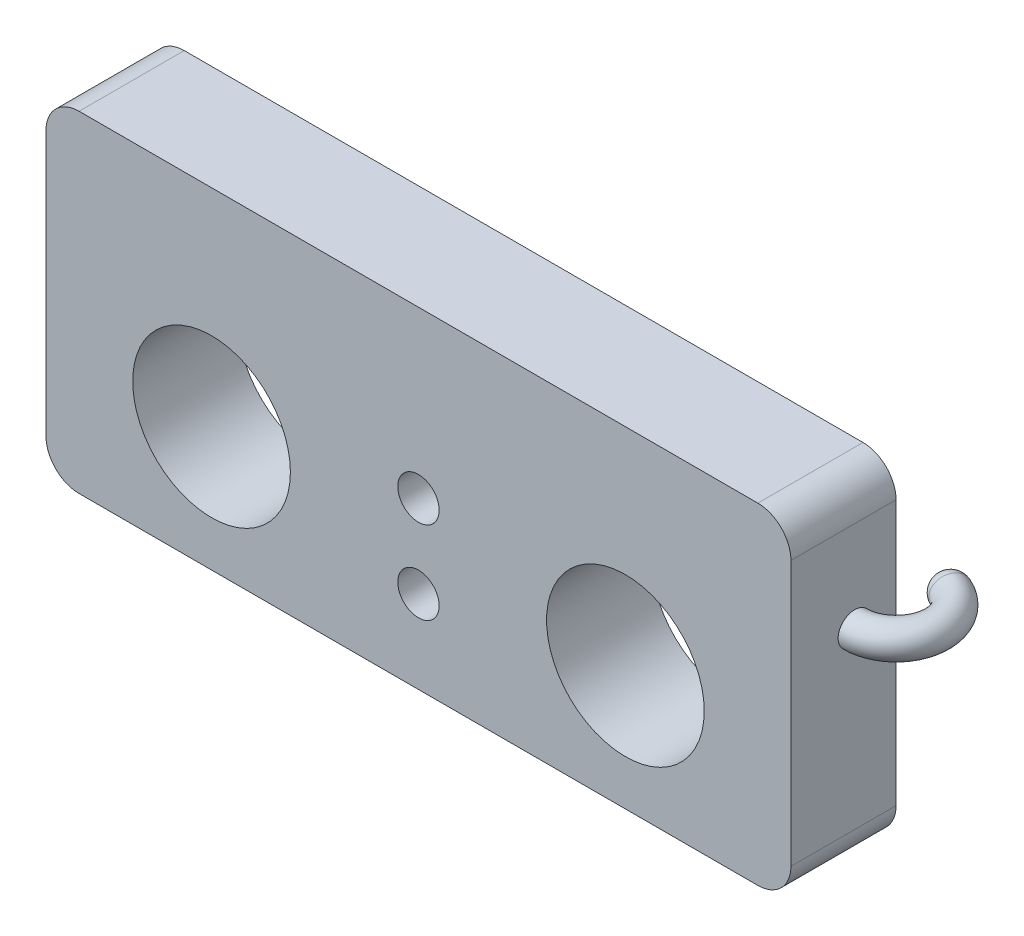
ISO-10303-21;
HEADER;
FILE_DESCRIPTION(('STEP AP214'),'2;1');
FILE_NAME('part.step','',(''),(''),'','','');
FILE_SCHEMA(('AUTOMOTIVE_DESIGN { 1 0 10303 214 1 1 1 1 }'));
ENDSEC;
DATA;
#1=APPLICATION_CONTEXT('core data for automotive mechanical design processes');
#2=APPLICATION_PROTOCOL_DEFINITION('international standard','automotive_design',2000,#1);
#3=PRODUCT_CONTEXT('',#1,'mechanical');
#4=PRODUCT('Part','Part','',(#3));
#5=PRODUCT_RELATED_PRODUCT_CATEGORY('part','',(#4));
#6=PRODUCT_DEFINITION_FORMATION('','',#4);
#7=PRODUCT_DEFINITION_CONTEXT('part definition',#1,'design');
#8=PRODUCT_DEFINITION('design','',#6,#7);
#9=PRODUCT_DEFINITION_SHAPE('','',#8);
#10=(LENGTH_UNIT() NAMED_UNIT(*) SI_UNIT(.MILLI.,.METRE.));
#11=(NAMED_UNIT(*) PLANE_ANGLE_UNIT() SI_UNIT($,.RADIAN.));
#12=(NAMED_UNIT(*) SI_UNIT($,.STERADIAN.) SOLID_ANGLE_UNIT());
#13=UNCERTAINTY_MEASURE_WITH_UNIT(LENGTH_MEASURE(1.E-05),#10,'distance_accuracy_value','');
#14=(GEOMETRIC_REPRESENTATION_CONTEXT(3) GLOBAL_UNCERTAINTY_ASSIGNED_CONTEXT((#13)) GLOBAL_UNIT_ASSIGNED_CONTEXT((#10,
#11,#12)) REPRESENTATION_CONTEXT('',''));
#15=CARTESIAN_POINT('',(0.,0.,0.));
#16=DIRECTION('',(0.,0.,1.));
#17=DIRECTION('',(1.,0.,0.));
#18=AXIS2_PLACEMENT_3D('',#15,#16,#17);
#19=CARTESIAN_POINT('',(0.,0.,6.35));
#20=DIRECTION('',(0.,0.,1.));
#21=DIRECTION('',(1.,0.,0.));
#22=AXIS2_PLACEMENT_3D('',#19,#20,#21);
#23=PLANE('',#22);
#24=CARTESIAN_POINT('',(5.81896551724137,-6.28448275862069,6.35));
#25=DIRECTION('',(0.,0.,1.));
#26=DIRECTION('',(1.,0.,0.));
#27=AXIS2_PLACEMENT_3D('',#24,#25,#26);
#28=CIRCLE('',#27,1.25);
#29=CARTESIAN_POINT('',(7.06896551724137,-6.28448275862069,6.35));
#30=VERTEX_POINT('',#29);
#31=EDGE_CURVE('E142',#30,#30,#28,.T.);
#32=ORIENTED_EDGE('',*,*,#31,.F.);
#33=EDGE_LOOP('',(#32));
#34=FACE_BOUND('',#33,.T.);
#35=CARTESIAN_POINT('',(5.81896551724137,-11.2844827586207,6.35));
#36=DIRECTION('',(0.,0.,1.));
#37=DIRECTION('',(1.,0.,0.));
#38=AXIS2_PLACEMENT_3D('',#35,#36,#37);
#39=CIRCLE('',#38,1.25);
#40=CARTESIAN_POINT('',(7.06896551724137,-11.2844827586207,6.35));
#41=VERTEX_POINT('',#40);
#42=EDGE_CURVE('E138',#41,#41,#39,.T.);
#43=ORIENTED_EDGE('',*,*,#42,.F.);
#44=EDGE_LOOP('',(#43));
#45=FACE_BOUND('',#44,.T.);
#46=CARTESIAN_POINT('',(-6.68103448275862,-8.78448275862069,6.35));
#47=DIRECTION('',(0.,0.,1.));
#48=DIRECTION('',(1.,0.,0.));
#49=AXIS2_PLACEMENT_3D('',#46,#47,#48);
#50=CIRCLE('',#49,4.7625);
#51=CARTESIAN_POINT('',(-1.91853448275862,-8.78448275862069,6.35));
#52=VERTEX_POINT('',#51);
#53=EDGE_CURVE('E271',#52,#52,#50,.T.);
#54=ORIENTED_EDGE('',*,*,#53,.F.);
#55=EDGE_LOOP('',(#54));
#56=FACE_BOUND('',#55,.T.);
#57=DIRECTION('',(1.,0.,0.));
#58=VECTOR('',#57,1.);
#59=CARTESIAN_POINT('',(-16.6810344827586,-16.2844827586207,6.35));
#60=LINE('',#59,#58);
#61=CARTESIAN_POINT('',(-14.6810344827586,-16.2844827586207,6.35));
#62=VERTEX_POINT('',#61);
#63=CARTESIAN_POINT('',(26.3189655172414,-16.2844827586207,6.35));
#64=VERTEX_POINT('',#63);
#65=EDGE_CURVE('E262',#62,#64,#60,.T.);
#66=ORIENTED_EDGE('',*,*,#65,.T.);
#67=CARTESIAN_POINT('',(26.3189655172414,-14.2844827586207,6.35));
#68=DIRECTION('',(0.,0.,1.));
#69=DIRECTION('',(1.,0.,0.));
#70=AXIS2_PLACEMENT_3D('',#67,#68,#69);
#71=CIRCLE('',#70,2.);
#72=CARTESIAN_POINT('',(28.3189655172414,-14.2844827586207,6.35));
#73=VERTEX_POINT('',#72);
#74=EDGE_CURVE('E157',#64,#73,#71,.T.);
#75=ORIENTED_EDGE('',*,*,#74,.T.);
#76=DIRECTION('',(0.,1.,0.));
#77=VECTOR('',#76,1.);
#78=CARTESIAN_POINT('',(28.3189655172414,3.71551724137931,6.35));
#79=LINE('',#78,#77);
#80=CARTESIAN_POINT('',(28.3189655172414,1.71551724137931,6.35));
#81=VERTEX_POINT('',#80);
#82=EDGE_CURVE('E118',#73,#81,#79,.T.);
#83=ORIENTED_EDGE('',*,*,#82,.T.);
#84=CARTESIAN_POINT('',(26.3189655172414,1.71551724137931,6.35));
#85=DIRECTION('',(0.,0.,1.));
#86=DIRECTION('',(1.,0.,0.));
#87=AXIS2_PLACEMENT_3D('',#84,#85,#86);
#88=CIRCLE('',#87,2.);
#89=CARTESIAN_POINT('',(26.3189655172414,3.71551724137931,6.35));
#90=VERTEX_POINT('',#89);
#91=EDGE_CURVE('E54',#81,#90,#88,.T.);
#92=ORIENTED_EDGE('',*,*,#91,.T.);
#93=DIRECTION('',(-1.,0.,0.));
#94=VECTOR('',#93,1.);
#95=CARTESIAN_POINT('',(-16.6810344827586,3.71551724137931,6.35));
#96=LINE('',#95,#94);
#97=CARTESIAN_POINT('',(-14.6810344827586,3.71551724137931,6.35));
#98=VERTEX_POINT('',#97);
#99=EDGE_CURVE('E143',#90,#98,#96,.T.);
#100=ORIENTED_EDGE('',*,*,#99,.T.);
#101=CARTESIAN_POINT('',(-14.6810344827586,1.71551724137931,6.35));
#102=DIRECTION('',(0.,0.,1.));
#103=DIRECTION('',(1.,0.,0.));
#104=AXIS2_PLACEMENT_3D('',#101,#102,#103);
#105=CIRCLE('',#104,2.);
#106=CARTESIAN_POINT('',(-16.6810344827586,1.71551724137931,6.35));
#107=VERTEX_POINT('',#106);
#108=EDGE_CURVE('E154',#98,#107,#105,.T.);
#109=ORIENTED_EDGE('',*,*,#108,.T.);
#110=DIRECTION('',(0.,-1.,0.));
#111=VECTOR('',#110,1.);
#112=CARTESIAN_POINT('',(-16.6810344827586,3.71551724137931,6.35));
#113=LINE('',#112,#111);
#114=CARTESIAN_POINT('',(-16.6810344827586,-14.2844827586207,6.35));
#115=VERTEX_POINT('',#114);
#116=EDGE_CURVE('E128',#107,#115,#113,.T.);
#117=ORIENTED_EDGE('',*,*,#116,.T.);
#118=CARTESIAN_POINT('',(-14.6810344827586,-14.2844827586207,6.35));
#119=DIRECTION('',(0.,0.,1.));
#120=DIRECTION('',(1.,0.,0.));
#121=AXIS2_PLACEMENT_3D('',#118,#119,#120);
#122=CIRCLE('',#121,2.);
#123=EDGE_CURVE('E152',#115,#62,#122,.T.);
#124=ORIENTED_EDGE('',*,*,#123,.T.);
#125=EDGE_LOOP('',(#66,#75,#83,#92,#100,#109,#117,#124));
#126=FACE_BOUND('',#125,.T.);
#127=CARTESIAN_POINT('',(18.3189655172414,-8.78448275862069,6.35));
#128=DIRECTION('',(0.,0.,1.));
#129=DIRECTION('',(1.,0.,0.));
#130=AXIS2_PLACEMENT_3D('',#127,#128,#129);
#131=CIRCLE('',#130,4.7625);
#132=CARTESIAN_POINT('',(23.0814655172414,-8.78448275862069,6.35));
#133=VERTEX_POINT('',#132);
#134=EDGE_CURVE('E277',#133,#133,#131,.T.);
#135=ORIENTED_EDGE('',*,*,#134,.F.);
#136=EDGE_LOOP('',(#135));
#137=FACE_BOUND('',#136,.T.);
#138=ADVANCED_FACE('F32',(#34,#45,#56,#126,#137),#23,.T.);
#139=CARTESIAN_POINT('',(0.,0.,0.));
#140=DIRECTION('',(0.,0.,1.));
#141=DIRECTION('',(1.,0.,0.));
#142=AXIS2_PLACEMENT_3D('',#139,#140,#141);
#143=PLANE('',#142);
#144=CARTESIAN_POINT('',(5.81896551724137,-6.28448275862069,0.));
#145=DIRECTION('',(0.,0.,1.));
#146=DIRECTION('',(1.,0.,0.));
#147=AXIS2_PLACEMENT_3D('',#144,#145,#146);
#148=CIRCLE('',#147,1.25);
#149=CARTESIAN_POINT('',(7.06896551724137,-6.28448275862069,0.));
#150=VERTEX_POINT('',#149);
#151=EDGE_CURVE('E139',#150,#150,#148,.T.);
#152=ORIENTED_EDGE('',*,*,#151,.T.);
#153=EDGE_LOOP('',(#152));
#154=FACE_BOUND('',#153,.T.);
#155=CARTESIAN_POINT('',(5.81896551724137,-11.2844827586207,0.));
#156=DIRECTION('',(0.,0.,1.));
#157=DIRECTION('',(1.,0.,0.));
#158=AXIS2_PLACEMENT_3D('',#155,#156,#157);
#159=CIRCLE('',#158,1.25);
#160=CARTESIAN_POINT('',(7.06896551724137,-11.2844827586207,0.));
#161=VERTEX_POINT('',#160);
#162=EDGE_CURVE('E134',#161,#161,#159,.T.);
#163=ORIENTED_EDGE('',*,*,#162,.T.);
#164=EDGE_LOOP('',(#163));
#165=FACE_BOUND('',#164,.T.);
#166=DIRECTION('',(0.,1.,0.));
#167=VECTOR('',#166,1.);
#168=CARTESIAN_POINT('',(28.3189655172414,3.71551724137931,0.));
#169=LINE('',#168,#167);
#170=CARTESIAN_POINT('',(28.3189655172414,-14.2844827586207,0.));
#171=VERTEX_POINT('',#170);
#172=CARTESIAN_POINT('',(28.3189655172414,1.71551724137931,0.));
#173=VERTEX_POINT('',#172);
#174=EDGE_CURVE('E116',#171,#173,#169,.T.);
#175=ORIENTED_EDGE('',*,*,#174,.F.);
#176=CARTESIAN_POINT('',(26.3189655172414,-14.2844827586207,0.));
#177=DIRECTION('',(0.,0.,1.));
#178=DIRECTION('',(1.,0.,0.));
#179=AXIS2_PLACEMENT_3D('',#176,#177,#178);
#180=CIRCLE('',#179,2.);
#181=CARTESIAN_POINT('',(26.3189655172414,-16.2844827586207,0.));
#182=VERTEX_POINT('',#181);
#183=EDGE_CURVE('E99',#171,#182,#180,.F.);
#184=ORIENTED_EDGE('',*,*,#183,.T.);
#185=DIRECTION('',(1.,0.,0.));
#186=VECTOR('',#185,1.);
#187=CARTESIAN_POINT('',(-16.6810344827586,-16.2844827586207,0.));
#188=LINE('',#187,#186);
#189=CARTESIAN_POINT('',(-14.6810344827586,-16.2844827586207,0.));
#190=VERTEX_POINT('',#189);
#191=EDGE_CURVE('E126',#190,#182,#188,.T.);
#192=ORIENTED_EDGE('',*,*,#191,.F.);
#193=CARTESIAN_POINT('',(-14.6810344827586,-14.2844827586207,0.));
#194=DIRECTION('',(0.,0.,1.));
#195=DIRECTION('',(1.,0.,0.));
#196=AXIS2_PLACEMENT_3D('',#193,#194,#195);
#197=CIRCLE('',#196,2.);
#198=CARTESIAN_POINT('',(-16.6810344827586,-14.2844827586207,0.));
#199=VERTEX_POINT('',#198);
#200=EDGE_CURVE('E119',#190,#199,#197,.F.);
#201=ORIENTED_EDGE('',*,*,#200,.T.);
#202=DIRECTION('',(0.,-1.,0.));
#203=VECTOR('',#202,1.);
#204=CARTESIAN_POINT('',(-16.6810344827586,3.71551724137931,0.));
#205=LINE('',#204,#203);
#206=CARTESIAN_POINT('',(-16.6810344827586,1.71551724137931,0.));
#207=VERTEX_POINT('',#206);
#208=EDGE_CURVE('E130',#207,#199,#205,.T.);
#209=ORIENTED_EDGE('',*,*,#208,.F.);
#210=CARTESIAN_POINT('',(-14.6810344827586,1.71551724137931,0.));
#211=DIRECTION('',(0.,0.,1.));
#212=DIRECTION('',(1.,0.,0.));
#213=AXIS2_PLACEMENT_3D('',#210,#211,#212);
#214=CIRCLE('',#213,2.);
#215=CARTESIAN_POINT('',(-14.6810344827586,3.71551724137931,0.));
#216=VERTEX_POINT('',#215);
#217=EDGE_CURVE('E146',#207,#216,#214,.F.);
#218=ORIENTED_EDGE('',*,*,#217,.T.);
#219=DIRECTION('',(-1.,0.,0.));
#220=VECTOR('',#219,1.);
#221=CARTESIAN_POINT('',(-16.6810344827586,3.71551724137931,0.));
#222=LINE('',#221,#220);
#223=CARTESIAN_POINT('',(26.3189655172414,3.71551724137931,0.));
#224=VERTEX_POINT('',#223);
#225=EDGE_CURVE('E125',#224,#216,#222,.T.);
#226=ORIENTED_EDGE('',*,*,#225,.F.);
#227=CARTESIAN_POINT('',(26.3189655172414,1.71551724137931,0.));
#228=DIRECTION('',(0.,0.,1.));
#229=DIRECTION('',(1.,0.,0.));
#230=AXIS2_PLACEMENT_3D('',#227,#228,#229);
#231=CIRCLE('',#230,2.);
#232=EDGE_CURVE('E110',#224,#173,#231,.F.);
#233=ORIENTED_EDGE('',*,*,#232,.T.);
#234=EDGE_LOOP('',(#175,#184,#192,#201,#209,#218,#226,#233));
#235=FACE_BOUND('',#234,.T.);
#236=CARTESIAN_POINT('',(-6.68103448275862,-8.78448275862069,0.));
#237=DIRECTION('',(0.,0.,1.));
#238=DIRECTION('',(1.,0.,0.));
#239=AXIS2_PLACEMENT_3D('',#236,#237,#238);
#240=CIRCLE('',#239,4.7625);
#241=CARTESIAN_POINT('',(-1.91853448275862,-8.78448275862069,0.));
#242=VERTEX_POINT('',#241);
#243=EDGE_CURVE('E273',#242,#242,#240,.T.);
#244=ORIENTED_EDGE('',*,*,#243,.T.);
#245=EDGE_LOOP('',(#244));
#246=FACE_BOUND('',#245,.T.);
#247=CARTESIAN_POINT('',(18.3189655172414,-8.78448275862069,0.));
#248=DIRECTION('',(0.,0.,1.));
#249=DIRECTION('',(1.,0.,0.));
#250=AXIS2_PLACEMENT_3D('',#247,#248,#249);
#251=CIRCLE('',#250,4.7625);
#252=CARTESIAN_POINT('',(23.0814655172414,-8.78448275862069,0.));
#253=VERTEX_POINT('',#252);
#254=EDGE_CURVE('E137',#253,#253,#251,.T.);
#255=ORIENTED_EDGE('',*,*,#254,.T.);
#256=EDGE_LOOP('',(#255));
#257=FACE_BOUND('',#256,.T.);
#258=ADVANCED_FACE('F122',(#154,#165,#235,#246,#257),#143,.F.);
#259=CARTESIAN_POINT('',(-16.6810344827586,3.71551724137931,6.35));
#260=DIRECTION('',(1.,0.,0.));
#261=DIRECTION('',(0.,1.,0.));
#262=AXIS2_PLACEMENT_3D('',#259,#260,#261);
#263=PLANE('',#262);
#264=CARTESIAN_POINT('',(-16.6810344827586,-3.78448275862069,2.5));
#265=DIRECTION('',(1.,0.,0.));
#266=DIRECTION('',(0.,1.,0.));
#267=AXIS2_PLACEMENT_3D('',#264,#265,#266);
#268=CIRCLE('',#267,1.);
#269=CARTESIAN_POINT('',(-16.6810344827586,-3.78448275862069,3.5));
#270=VERTEX_POINT('',#269);
#271=EDGE_CURVE('E168',#270,#270,#268,.F.);
#272=ORIENTED_EDGE('',*,*,#271,.F.);
#273=EDGE_LOOP('',(#272));
#274=FACE_BOUND('',#273,.T.);
#275=ORIENTED_EDGE('',*,*,#116,.F.);
#276=DIRECTION('',(0.,0.,-1.));
#277=VECTOR('',#276,1.);
#278=CARTESIAN_POINT('',(-16.6810344827586,1.71551724137931,6.35));
#279=LINE('',#278,#277);
#280=EDGE_CURVE('E165',#107,#207,#279,.T.);
#281=ORIENTED_EDGE('',*,*,#280,.T.);
#282=ORIENTED_EDGE('',*,*,#208,.T.);
#283=DIRECTION('',(0.,0.,-1.));
#284=VECTOR('',#283,1.);
#285=CARTESIAN_POINT('',(-16.6810344827586,-14.2844827586207,6.35));
#286=LINE('',#285,#284);
#287=EDGE_CURVE('E163',#199,#115,#286,.F.);
#288=ORIENTED_EDGE('',*,*,#287,.T.);
#289=EDGE_LOOP('',(#275,#281,#282,#288));
#290=FACE_BOUND('',#289,.T.);
#291=ADVANCED_FACE('F188',(#274,#290),#263,.F.);
#292=CARTESIAN_POINT('',(-16.6810344827586,-16.2844827586207,6.35));
#293=DIRECTION('',(0.,1.,0.));
#294=DIRECTION('',(0.,0.,1.));
#295=AXIS2_PLACEMENT_3D('',#292,#293,#294);
#296=PLANE('',#295);
#297=ORIENTED_EDGE('',*,*,#191,.T.);
#298=DIRECTION('',(0.,0.,-1.));
#299=VECTOR('',#298,1.);
#300=CARTESIAN_POINT('',(26.3189655172414,-16.2844827586207,6.35));
#301=LINE('',#300,#299);
#302=EDGE_CURVE('E104',#182,#64,#301,.F.);
#303=ORIENTED_EDGE('',*,*,#302,.T.);
#304=ORIENTED_EDGE('',*,*,#65,.F.);
#305=DIRECTION('',(0.,0.,-1.));
#306=VECTOR('',#305,1.);
#307=CARTESIAN_POINT('',(-14.6810344827586,-16.2844827586207,6.35));
#308=LINE('',#307,#306);
#309=EDGE_CURVE('E109',#62,#190,#308,.T.);
#310=ORIENTED_EDGE('',*,*,#309,.T.);
#311=EDGE_LOOP('',(#297,#303,#304,#310));
#312=FACE_BOUND('',#311,.T.);
#313=ADVANCED_FACE('F180',(#312),#296,.F.);
#314=CARTESIAN_POINT('',(28.3189655172414,3.71551724137931,6.35));
#315=DIRECTION('',(-1.,0.,0.));
#316=DIRECTION('',(0.,-1.,0.));
#317=AXIS2_PLACEMENT_3D('',#314,#315,#316);
#318=PLANE('',#317);
#319=CARTESIAN_POINT('',(28.3189655172414,-3.78448275862068,2.5));
#320=DIRECTION('',(-1.,0.,0.));
#321=DIRECTION('',(0.,-1.,0.));
#322=AXIS2_PLACEMENT_3D('',#319,#320,#321);
#323=CIRCLE('',#322,1.);
#324=CARTESIAN_POINT('',(28.3189655172414,-3.78448275862068,3.5));
#325=VERTEX_POINT('',#324);
#326=EDGE_CURVE('E40',#325,#325,#323,.F.);
#327=ORIENTED_EDGE('',*,*,#326,.F.);
#328=EDGE_LOOP('',(#327));
#329=FACE_BOUND('',#328,.T.);
#330=ORIENTED_EDGE('',*,*,#82,.F.);
#331=DIRECTION('',(0.,0.,-1.));
#332=VECTOR('',#331,1.);
#333=CARTESIAN_POINT('',(28.3189655172414,-14.2844827586207,6.35));
#334=LINE('',#333,#332);
#335=EDGE_CURVE('E103',#73,#171,#334,.T.);
#336=ORIENTED_EDGE('',*,*,#335,.T.);
#337=ORIENTED_EDGE('',*,*,#174,.T.);
#338=DIRECTION('',(0.,0.,-1.));
#339=VECTOR('',#338,1.);
#340=CARTESIAN_POINT('',(28.3189655172414,1.71551724137931,6.35));
#341=LINE('',#340,#339);
#342=EDGE_CURVE('E120',#173,#81,#341,.F.);
#343=ORIENTED_EDGE('',*,*,#342,.T.);
#344=EDGE_LOOP('',(#330,#336,#337,#343));
#345=FACE_BOUND('',#344,.T.);
#346=ADVANCED_FACE('F115',(#329,#345),#318,.F.);
#347=CARTESIAN_POINT('',(-16.6810344827586,3.71551724137931,6.35));
#348=DIRECTION('',(0.,-1.,0.));
#349=DIRECTION('',(0.,0.,-1.));
#350=AXIS2_PLACEMENT_3D('',#347,#348,#349);
#351=PLANE('',#350);
#352=ORIENTED_EDGE('',*,*,#99,.F.);
#353=DIRECTION('',(0.,0.,-1.));
#354=VECTOR('',#353,1.);
#355=CARTESIAN_POINT('',(26.3189655172414,3.71551724137931,6.35));
#356=LINE('',#355,#354);
#357=EDGE_CURVE('E160',#90,#224,#356,.T.);
#358=ORIENTED_EDGE('',*,*,#357,.T.);
#359=ORIENTED_EDGE('',*,*,#225,.T.);
#360=DIRECTION('',(0.,0.,-1.));
#361=VECTOR('',#360,1.);
#362=CARTESIAN_POINT('',(-14.6810344827586,3.71551724137931,6.35));
#363=LINE('',#362,#361);
#364=EDGE_CURVE('E47',#216,#98,#363,.F.);
#365=ORIENTED_EDGE('',*,*,#364,.T.);
#366=EDGE_LOOP('',(#352,#358,#359,#365));
#367=FACE_BOUND('',#366,.T.);
#368=ADVANCED_FACE('F179',(#367),#351,.F.);
#369=CARTESIAN_POINT('',(-6.68103448275862,-8.78448275862069,6.35));
#370=DIRECTION('',(0.,0.,-1.));
#371=DIRECTION('',(-1.,0.,0.));
#372=AXIS2_PLACEMENT_3D('',#369,#370,#371);
#373=CYLINDRICAL_SURFACE('',#372,4.7625);
#374=ORIENTED_EDGE('',*,*,#53,.T.);
#375=EDGE_LOOP('',(#374));
#376=FACE_BOUND('',#375,.T.);
#377=ORIENTED_EDGE('',*,*,#243,.F.);
#378=EDGE_LOOP('',(#377));
#379=FACE_BOUND('',#378,.T.);
#380=ADVANCED_FACE('F186',(#376,#379),#373,.F.);
#381=CARTESIAN_POINT('',(18.3189655172414,-8.78448275862069,6.35));
#382=DIRECTION('',(0.,0.,-1.));
#383=DIRECTION('',(-1.,0.,0.));
#384=AXIS2_PLACEMENT_3D('',#381,#382,#383);
#385=CYLINDRICAL_SURFACE('',#384,4.7625);
#386=ORIENTED_EDGE('',*,*,#134,.T.);
#387=EDGE_LOOP('',(#386));
#388=FACE_BOUND('',#387,.T.);
#389=ORIENTED_EDGE('',*,*,#254,.F.);
#390=EDGE_LOOP('',(#389));
#391=FACE_BOUND('',#390,.T.);
#392=ADVANCED_FACE('F204',(#388,#391),#385,.F.);
#393=CARTESIAN_POINT('',(5.81896551724137,-11.2844827586207,6.35));
#394=DIRECTION('',(0.,0.,1.));
#395=DIRECTION('',(1.,0.,0.));
#396=AXIS2_PLACEMENT_3D('',#393,#394,#395);
#397=CYLINDRICAL_SURFACE('',#396,1.25);
#398=ORIENTED_EDGE('',*,*,#42,.T.);
#399=EDGE_LOOP('',(#398));
#400=FACE_BOUND('',#399,.T.);
#401=ORIENTED_EDGE('',*,*,#162,.F.);
#402=EDGE_LOOP('',(#401));
#403=FACE_BOUND('',#402,.T.);
#404=ADVANCED_FACE('F208',(#400,#403),#397,.F.);
#405=CARTESIAN_POINT('',(5.81896551724137,-6.28448275862069,6.35));
#406=DIRECTION('',(0.,0.,1.));
#407=DIRECTION('',(1.,0.,0.));
#408=AXIS2_PLACEMENT_3D('',#405,#406,#407);
#409=CYLINDRICAL_SURFACE('',#408,1.25);
#410=ORIENTED_EDGE('',*,*,#31,.T.);
#411=EDGE_LOOP('',(#410));
#412=FACE_BOUND('',#411,.T.);
#413=ORIENTED_EDGE('',*,*,#151,.F.);
#414=EDGE_LOOP('',(#413));
#415=FACE_BOUND('',#414,.T.);
#416=ADVANCED_FACE('F212',(#412,#415),#409,.F.);
#417=CARTESIAN_POINT('',(26.3189655172414,-14.2844827586207,6.35));
#418=DIRECTION('',(0.,0.,-1.));
#419=DIRECTION('',(-1.,0.,0.));
#420=AXIS2_PLACEMENT_3D('',#417,#418,#419);
#421=CYLINDRICAL_SURFACE('',#420,2.);
#422=ORIENTED_EDGE('',*,*,#74,.F.);
#423=ORIENTED_EDGE('',*,*,#302,.F.);
#424=ORIENTED_EDGE('',*,*,#183,.F.);
#425=ORIENTED_EDGE('',*,*,#335,.F.);
#426=EDGE_LOOP('',(#422,#423,#424,#425));
#427=FACE_BOUND('',#426,.T.);
#428=ADVANCED_FACE('F102',(#427),#421,.T.);
#429=CARTESIAN_POINT('',(26.3189655172414,1.71551724137931,6.35));
#430=DIRECTION('',(0.,0.,-1.));
#431=DIRECTION('',(-1.,0.,0.));
#432=AXIS2_PLACEMENT_3D('',#429,#430,#431);
#433=CYLINDRICAL_SURFACE('',#432,2.);
#434=ORIENTED_EDGE('',*,*,#91,.F.);
#435=ORIENTED_EDGE('',*,*,#342,.F.);
#436=ORIENTED_EDGE('',*,*,#232,.F.);
#437=ORIENTED_EDGE('',*,*,#357,.F.);
#438=EDGE_LOOP('',(#434,#435,#436,#437));
#439=FACE_BOUND('',#438,.T.);
#440=ADVANCED_FACE('F242',(#439),#433,.T.);
#441=CARTESIAN_POINT('',(-14.6810344827586,1.71551724137931,6.35));
#442=DIRECTION('',(0.,0.,-1.));
#443=DIRECTION('',(-1.,0.,0.));
#444=AXIS2_PLACEMENT_3D('',#441,#442,#443);
#445=CYLINDRICAL_SURFACE('',#444,2.);
#446=ORIENTED_EDGE('',*,*,#108,.F.);
#447=ORIENTED_EDGE('',*,*,#364,.F.);
#448=ORIENTED_EDGE('',*,*,#217,.F.);
#449=ORIENTED_EDGE('',*,*,#280,.F.);
#450=EDGE_LOOP('',(#446,#447,#448,#449));
#451=FACE_BOUND('',#450,.T.);
#452=ADVANCED_FACE('F238',(#451),#445,.T.);
#453=CARTESIAN_POINT('',(-14.6810344827586,-14.2844827586207,6.35));
#454=DIRECTION('',(0.,0.,-1.));
#455=DIRECTION('',(-1.,0.,0.));
#456=AXIS2_PLACEMENT_3D('',#453,#454,#455);
#457=CYLINDRICAL_SURFACE('',#456,2.);
#458=ORIENTED_EDGE('',*,*,#123,.F.);
#459=ORIENTED_EDGE('',*,*,#287,.F.);
#460=ORIENTED_EDGE('',*,*,#200,.F.);
#461=ORIENTED_EDGE('',*,*,#309,.F.);
#462=EDGE_LOOP('',(#458,#459,#460,#461));
#463=FACE_BOUND('',#462,.T.);
#464=ADVANCED_FACE('F221',(#463),#457,.T.);
#465=CARTESIAN_POINT('',(-16.6810344827586,-3.78448275862069,0.));
#466=DIRECTION('',(0.,1.,0.));
#467=DIRECTION('',(-1.,0.,0.));
#468=AXIS2_PLACEMENT_3D('',#465,#466,#467);
#469=TOROIDAL_SURFACE('',#468,2.5,1.);
#470=CARTESIAN_POINT('',(-17.6810344827586,-3.78448275862069,-2.29128784747793));
#471=DIRECTION('',(-0.916515138991171,0.,0.399999999999994));
#472=DIRECTION('',(0.399999999999994,0.,0.916515138991171));
#473=AXIS2_PLACEMENT_3D('',#470,#471,#472);
#474=CIRCLE('',#473,1.);
#475=CARTESIAN_POINT('',(-18.0810344827586,-3.78448275862069,-3.2078029864691));
#476=VERTEX_POINT('',#475);
#477=EDGE_CURVE('E171',#476,#476,#474,.T.);
#478=CARTESIAN_POINT('',(-16.6810344827586,-3.78448275862069,0.));
#479=DIRECTION('',(0.,1.,0.));
#480=DIRECTION('',(-1.,0.,0.));
#481=AXIS2_PLACEMENT_3D('',#478,#479,#480);
#482=CIRCLE('',#481,3.5);
#483=EDGE_CURVE('',#476,#270,#482,.T.);
#484=ORIENTED_EDGE('',*,*,#477,.T.);
#485=ORIENTED_EDGE('',*,*,#271,.T.);
#486=ORIENTED_EDGE('',*,*,#483,.T.);
#487=ORIENTED_EDGE('',*,*,#483,.F.);
#488=EDGE_LOOP('',(#484,#486,#485,#487));
#489=FACE_BOUND('',#488,.T.);
#490=ADVANCED_FACE('F217',(#489),#469,.T.);
#491=CARTESIAN_POINT('',(-17.6810344827586,-3.78448275862069,-2.29128784747793));
#492=DIRECTION('',(1.,0.,0.));
#493=DIRECTION('',(0.,0.,-1.));
#494=AXIS2_PLACEMENT_3D('',#491,#492,#493);
#495=SPHERICAL_SURFACE('',#494,1.);
#496=CARTESIAN_POINT('',(-17.6810344827586,-3.78448275862069,-2.29128784747793));
#497=DIRECTION('',(-0.916515138991171,0.,0.399999999999994));
#498=DIRECTION('',(0.399999999999994,0.,0.916515138991171));
#499=AXIS2_PLACEMENT_3D('',#496,#497,#498);
#500=SPHERICAL_SURFACE('',#499,1.);
#501=ORIENTED_EDGE('',*,*,#477,.F.);
#502=EDGE_LOOP('',(#501));
#503=FACE_BOUND('',#502,.T.);
#504=ADVANCED_FACE('F220',(#503),#500,.T.);
#505=CARTESIAN_POINT('',(28.3189655172414,-3.78448275862068,0.));
#506=DIRECTION('',(0.,1.,0.));
#507=DIRECTION('',(1.,0.,0.));
#508=AXIS2_PLACEMENT_3D('',#505,#506,#507);
#509=TOROIDAL_SURFACE('',#508,2.5,1.);
#510=CARTESIAN_POINT('',(29.3189655172414,-3.78448275862068,-2.29128784747793));
#511=DIRECTION('',(-0.916515138991171,0.,-0.399999999999992));
#512=DIRECTION('',(-0.399999999999992,0.,0.916515138991171));
#513=AXIS2_PLACEMENT_3D('',#510,#511,#512);
#514=CIRCLE('',#513,1.);
#515=CARTESIAN_POINT('',(29.7189655172413,-3.78448275862068,-3.2078029864691));
#516=VERTEX_POINT('',#515);
#517=EDGE_CURVE('E11',#516,#516,#514,.F.);
#518=CARTESIAN_POINT('',(28.3189655172414,-3.78448275862068,0.));
#519=DIRECTION('',(0.,1.,0.));
#520=DIRECTION('',(1.,0.,0.));
#521=AXIS2_PLACEMENT_3D('',#518,#519,#520);
#522=CIRCLE('',#521,3.5);
#523=EDGE_CURVE('',#325,#516,#522,.T.);
#524=ORIENTED_EDGE('',*,*,#326,.T.);
#525=ORIENTED_EDGE('',*,*,#517,.T.);
#526=ORIENTED_EDGE('',*,*,#523,.T.);
#527=ORIENTED_EDGE('',*,*,#523,.F.);
#528=EDGE_LOOP('',(#524,#526,#525,#527));
#529=FACE_BOUND('',#528,.T.);
#530=ADVANCED_FACE('F176',(#529),#509,.T.);
#531=CARTESIAN_POINT('',(29.3189655172414,-3.78448275862068,-2.29128784747793));
#532=DIRECTION('',(-1.,0.,0.));
#533=DIRECTION('',(0.,0.,1.));
#534=AXIS2_PLACEMENT_3D('',#531,#532,#533);
#535=SPHERICAL_SURFACE('',#534,1.);
#536=CARTESIAN_POINT('',(29.3189655172414,-3.78448275862068,-2.29128784747793));
#537=DIRECTION('',(-0.916515138991171,0.,-0.399999999999992));
#538=DIRECTION('',(-0.399999999999992,0.,0.916515138991171));
#539=AXIS2_PLACEMENT_3D('',#536,#537,#538);
#540=SPHERICAL_SURFACE('',#539,1.);
#541=ORIENTED_EDGE('',*,*,#517,.F.);
#542=EDGE_LOOP('',(#541));
#543=FACE_BOUND('',#542,.T.);
#544=ADVANCED_FACE('F34',(#543),#540,.T.);
#545=CLOSED_SHELL('',(#138,#258,#291,#313,#346,#368,#380,#392,#404,#416,#428,#440,#452,#464,
#490,#504,#530,#544));
#546=MANIFOLD_SOLID_BREP('B2',#545);
#547=ADVANCED_BREP_SHAPE_REPRESENTATION('',(#18,#546),#14);
#548=SHAPE_DEFINITION_REPRESENTATION(#9,#547);
ENDSEC;
END-ISO-10303-21;
